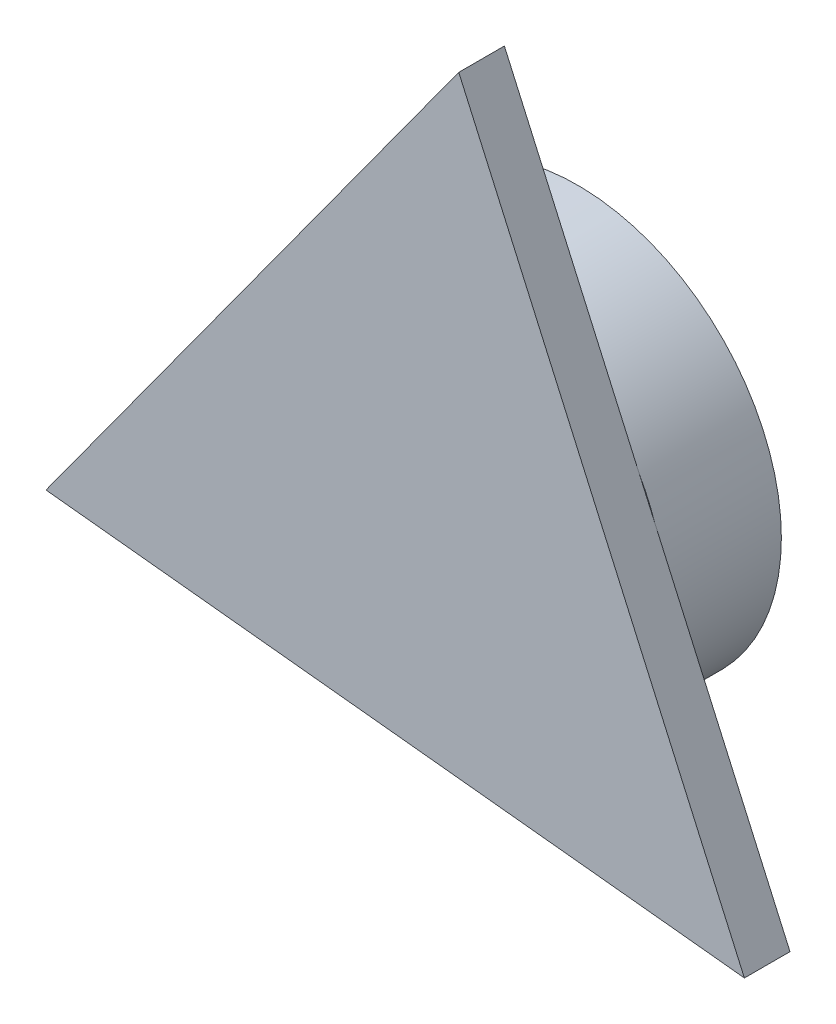
ISO-10303-21;
HEADER;
FILE_DESCRIPTION(('STEP AP214'),'2;1');
FILE_NAME('part.step','',(''),(''),'','','');
FILE_SCHEMA(('AUTOMOTIVE_DESIGN { 1 0 10303 214 1 1 1 1 }'));
ENDSEC;
DATA;
#1=APPLICATION_CONTEXT('core data for automotive mechanical design processes');
#2=APPLICATION_PROTOCOL_DEFINITION('international standard','automotive_design',2000,#1);
#3=PRODUCT_CONTEXT('',#1,'mechanical');
#4=PRODUCT('Part','Part','',(#3));
#5=PRODUCT_RELATED_PRODUCT_CATEGORY('part','',(#4));
#6=PRODUCT_DEFINITION_FORMATION('','',#4);
#7=PRODUCT_DEFINITION_CONTEXT('part definition',#1,'design');
#8=PRODUCT_DEFINITION('design','',#6,#7);
#9=PRODUCT_DEFINITION_SHAPE('','',#8);
#10=(LENGTH_UNIT() NAMED_UNIT(*) SI_UNIT(.MILLI.,.METRE.));
#11=(NAMED_UNIT(*) PLANE_ANGLE_UNIT() SI_UNIT($,.RADIAN.));
#12=(NAMED_UNIT(*) SI_UNIT($,.STERADIAN.) SOLID_ANGLE_UNIT());
#13=UNCERTAINTY_MEASURE_WITH_UNIT(LENGTH_MEASURE(1.E-05),#10,'distance_accuracy_value','');
#14=(GEOMETRIC_REPRESENTATION_CONTEXT(3) GLOBAL_UNCERTAINTY_ASSIGNED_CONTEXT((#13)) GLOBAL_UNIT_ASSIGNED_CONTEXT((#10,
#11,#12)) REPRESENTATION_CONTEXT('',''));
#15=CARTESIAN_POINT('',(0.,0.,0.));
#16=DIRECTION('',(0.,0.,1.));
#17=DIRECTION('',(1.,0.,0.));
#18=AXIS2_PLACEMENT_3D('',#15,#16,#17);
#19=CARTESIAN_POINT('',(0.,0.,19.32));
#20=DIRECTION('',(0.,0.,-1.));
#21=DIRECTION('',(-1.,0.,0.));
#22=AXIS2_PLACEMENT_3D('',#19,#20,#21);
#23=PLANE('',#22);
#24=CARTESIAN_POINT('',(51.9567828541551,1.17038599399259,19.32));
#25=DIRECTION('',(0.,0.,-1.));
#26=DIRECTION('',(-1.,0.,0.));
#27=AXIS2_PLACEMENT_3D('',#24,#25,#26);
#28=CIRCLE('',#27,4.465);
#29=CARTESIAN_POINT('',(55.851499327286,3.35382561851228,19.32));
#30=VERTEX_POINT('',#29);
#31=CARTESIAN_POINT('',(56.1854687081211,2.60371810779862,19.32));
#32=VERTEX_POINT('',#31);
#33=EDGE_CURVE('E172',#30,#32,#28,.T.);
#34=ORIENTED_EDGE('',*,*,#33,.F.);
#35=DIRECTION('',(0.406736643075804,-0.913545457642599,0.));
#36=VECTOR('',#35,1.);
#37=CARTESIAN_POINT('',(52.8862678126239,10.0138446435829,19.32));
#38=LINE('',#37,#36);
#39=EDGE_CURVE('E11',#30,#32,#38,.T.);
#40=ORIENTED_EDGE('',*,*,#39,.T.);
#41=EDGE_LOOP('',(#34,#40));
#42=FACE_BOUND('',#41,.T.);
#43=ADVANCED_FACE('F37',(#42),#23,.F.);
#44=CARTESIAN_POINT('',(51.9003388000545,-3.29425722453637,19.32));
#45=VERTEX_POINT('',#44);
#46=CARTESIAN_POINT('',(51.0837419497869,-3.20842943706863,19.32));
#47=VERTEX_POINT('',#46);
#48=EDGE_CURVE('E173',#45,#47,#28,.T.);
#49=ORIENTED_EDGE('',*,*,#48,.F.);
#50=DIRECTION('',(-0.994521895368274,0.10452846326765,0.));
#51=VECTOR('',#50,1.);
#52=CARTESIAN_POINT('',(59.1507002227832,-4.056300917272,19.32));
#53=LINE('',#52,#51);
#54=EDGE_CURVE('E46',#45,#47,#53,.T.);
#55=ORIENTED_EDGE('',*,*,#54,.T.);
#56=EDGE_LOOP('',(#49,#55));
#57=FACE_BOUND('',#56,.T.);
#58=ADVANCED_FACE('F145',(#57),#23,.F.);
#59=CARTESIAN_POINT('',(51.9567828541551,1.17038599399259,26.6697222151364));
#60=DIRECTION('',(0.,0.,-1.));
#61=DIRECTION('',(-1.,0.,0.));
#62=AXIS2_PLACEMENT_3D('',#59,#60,#61);
#63=CYLINDRICAL_SURFACE('',#62,1.925);
#64=CARTESIAN_POINT('',(51.9567828541551,1.17038599399259,19.32));
#65=DIRECTION('',(0.,0.,-1.));
#66=DIRECTION('',(-1.,0.,0.));
#67=AXIS2_PLACEMENT_3D('',#64,#65,#66);
#68=CIRCLE('',#67,1.925);
#69=CARTESIAN_POINT('',(50.0317828541551,1.17038599399259,19.32));
#70=VERTEX_POINT('',#69);
#71=EDGE_CURVE('E116',#70,#70,#68,.F.);
#72=ORIENTED_EDGE('',*,*,#71,.T.);
#73=EDGE_LOOP('',(#72));
#74=FACE_BOUND('',#73,.T.);
#75=CARTESIAN_POINT('',(51.9567828541551,1.17038599399259,16.78));
#76=DIRECTION('',(0.,0.,-1.));
#77=DIRECTION('',(1.,0.,0.));
#78=AXIS2_PLACEMENT_3D('',#75,#76,#77);
#79=CIRCLE('',#78,1.925);
#80=CARTESIAN_POINT('',(53.8817828541551,1.17038599399259,16.78));
#81=VERTEX_POINT('',#80);
#82=EDGE_CURVE('E120',#81,#81,#79,.T.);
#83=ORIENTED_EDGE('',*,*,#82,.T.);
#84=EDGE_LOOP('',(#83));
#85=FACE_BOUND('',#84,.T.);
#86=ADVANCED_FACE('F133',(#74,#85),#63,.F.);
#87=CARTESIAN_POINT('',(51.9567828541551,1.17038599399259,16.78));
#88=DIRECTION('',(0.,0.,1.));
#89=DIRECTION('',(1.,0.,0.));
#90=AXIS2_PLACEMENT_3D('',#87,#88,#89);
#91=PLANE('',#90);
#92=CARTESIAN_POINT('',(51.9567828541551,1.17038599399259,16.78));
#93=DIRECTION('',(0.,0.,1.));
#94=DIRECTION('',(1.,0.,0.));
#95=AXIS2_PLACEMENT_3D('',#92,#93,#94);
#96=CIRCLE('',#95,4.465);
#97=CARTESIAN_POINT('',(56.4217828541551,1.17038599399259,16.78));
#98=VERTEX_POINT('',#97);
#99=EDGE_CURVE('E126',#98,#98,#96,.F.);
#100=ORIENTED_EDGE('',*,*,#99,.T.);
#101=EDGE_LOOP('',(#100));
#102=FACE_BOUND('',#101,.T.);
#103=ORIENTED_EDGE('',*,*,#82,.F.);
#104=EDGE_LOOP('',(#103));
#105=FACE_BOUND('',#104,.T.);
#106=ADVANCED_FACE('F135',(#102,#105),#91,.F.);
#107=CARTESIAN_POINT('',(51.9567828541551,1.17038599399259,16.78));
#108=DIRECTION('',(0.,0.,1.));
#109=DIRECTION('',(1.,0.,0.));
#110=AXIS2_PLACEMENT_3D('',#107,#108,#109);
#111=CYLINDRICAL_SURFACE('',#110,4.465);
#112=ORIENTED_EDGE('',*,*,#99,.F.);
#113=EDGE_LOOP('',(#112));
#114=FACE_BOUND('',#113,.T.);
#115=CARTESIAN_POINT('',(48.1185104351256,3.45158958800109,19.32));
#116=VERTEX_POINT('',#115);
#117=CARTESIAN_POINT('',(48.6011379045566,4.11586931124871,19.32));
#118=VERTEX_POINT('',#117);
#119=EDGE_CURVE('E41',#116,#118,#28,.T.);
#120=ORIENTED_EDGE('',*,*,#119,.T.);
#121=EDGE_CURVE('E169',#118,#30,#28,.T.);
#122=ORIENTED_EDGE('',*,*,#121,.T.);
#123=ORIENTED_EDGE('',*,*,#33,.T.);
#124=EDGE_CURVE('E99',#32,#45,#28,.T.);
#125=ORIENTED_EDGE('',*,*,#124,.T.);
#126=ORIENTED_EDGE('',*,*,#48,.T.);
#127=EDGE_CURVE('E129',#47,#116,#28,.T.);
#128=ORIENTED_EDGE('',*,*,#127,.T.);
#129=EDGE_LOOP('',(#120,#122,#123,#125,#126,#128));
#130=FACE_BOUND('',#129,.T.);
#131=ADVANCED_FACE('F137',(#114,#130),#111,.T.);
#132=ORIENTED_EDGE('',*,*,#119,.F.);
#133=DIRECTION('',(0.587785252292469,0.80901699437495,0.));
#134=VECTOR('',#133,1.);
#135=CARTESIAN_POINT('',(43.8333805270583,-2.44638574433302,19.32));
#136=LINE('',#135,#134);
#137=EDGE_CURVE('E61',#116,#118,#136,.T.);
#138=ORIENTED_EDGE('',*,*,#137,.T.);
#139=EDGE_LOOP('',(#132,#138));
#140=FACE_BOUND('',#139,.T.);
#141=ADVANCED_FACE('F39',(#140),#23,.F.);
#142=CARTESIAN_POINT('',(0.,0.,20.32));
#143=DIRECTION('',(0.,0.,-1.));
#144=DIRECTION('',(-1.,0.,0.));
#145=AXIS2_PLACEMENT_3D('',#142,#143,#144);
#146=PLANE('',#145);
#147=DIRECTION('',(0.406736643075804,-0.913545457642599,0.));
#148=VECTOR('',#147,1.);
#149=CARTESIAN_POINT('',(52.8862678126239,10.0138446435829,20.32));
#150=LINE('',#149,#148);
#151=CARTESIAN_POINT('',(52.8862678126239,10.0138446435829,20.32));
#152=VERTEX_POINT('',#151);
#153=CARTESIAN_POINT('',(59.1507002227832,-4.056300917272,20.32));
#154=VERTEX_POINT('',#153);
#155=EDGE_CURVE('E115',#152,#154,#150,.T.);
#156=ORIENTED_EDGE('',*,*,#155,.F.);
#157=DIRECTION('',(0.587785252292469,0.80901699437495,0.));
#158=VECTOR('',#157,1.);
#159=CARTESIAN_POINT('',(43.8333805270583,-2.44638574433302,20.32));
#160=LINE('',#159,#158);
#161=CARTESIAN_POINT('',(43.8333805270583,-2.44638574433302,20.32));
#162=VERTEX_POINT('',#161);
#163=EDGE_CURVE('E102',#162,#152,#160,.T.);
#164=ORIENTED_EDGE('',*,*,#163,.F.);
#165=DIRECTION('',(-0.994521895368274,0.10452846326765,0.));
#166=VECTOR('',#165,1.);
#167=CARTESIAN_POINT('',(59.1507002227832,-4.056300917272,20.32));
#168=LINE('',#167,#166);
#169=EDGE_CURVE('E182',#154,#162,#168,.T.);
#170=ORIENTED_EDGE('',*,*,#169,.F.);
#171=EDGE_LOOP('',(#156,#164,#170));
#172=FACE_BOUND('',#171,.T.);
#173=ADVANCED_FACE('F156',(#172),#146,.F.);
#174=CARTESIAN_POINT('',(43.8333805270583,-2.44638574433302,19.32));
#175=DIRECTION('',(0.80901699437495,-0.587785252292469,0.));
#176=DIRECTION('',(0.587785252292469,0.80901699437495,0.));
#177=AXIS2_PLACEMENT_3D('',#174,#175,#176);
#178=PLANE('',#177);
#179=ORIENTED_EDGE('',*,*,#163,.T.);
#180=DIRECTION('',(0.,0.,1.));
#181=VECTOR('',#180,1.);
#182=CARTESIAN_POINT('',(52.8862678126239,10.0138446435829,19.32));
#183=LINE('',#182,#181);
#184=CARTESIAN_POINT('',(52.8862678126239,10.0138446435829,19.32));
#185=VERTEX_POINT('',#184);
#186=EDGE_CURVE('E122',#185,#152,#183,.T.);
#187=ORIENTED_EDGE('',*,*,#186,.F.);
#188=EDGE_CURVE('E56',#118,#185,#136,.T.);
#189=ORIENTED_EDGE('',*,*,#188,.F.);
#190=ORIENTED_EDGE('',*,*,#137,.F.);
#191=CARTESIAN_POINT('',(43.8333805270583,-2.44638574433302,19.32));
#192=VERTEX_POINT('',#191);
#193=EDGE_CURVE('E171',#192,#116,#136,.T.);
#194=ORIENTED_EDGE('',*,*,#193,.F.);
#195=DIRECTION('',(0.,0.,1.));
#196=VECTOR('',#195,1.);
#197=CARTESIAN_POINT('',(43.8333805270583,-2.44638574433302,19.32));
#198=LINE('',#197,#196);
#199=EDGE_CURVE('E117',#192,#162,#198,.T.);
#200=ORIENTED_EDGE('',*,*,#199,.T.);
#201=EDGE_LOOP('',(#179,#187,#189,#190,#194,#200));
#202=FACE_BOUND('',#201,.T.);
#203=ADVANCED_FACE('F161',(#202),#178,.F.);
#204=CARTESIAN_POINT('',(59.1507002227832,-4.056300917272,19.32));
#205=DIRECTION('',(0.10452846326765,0.994521895368274,0.));
#206=DIRECTION('',(-0.994521895368274,0.10452846326765,0.));
#207=AXIS2_PLACEMENT_3D('',#204,#205,#206);
#208=PLANE('',#207);
#209=ORIENTED_EDGE('',*,*,#169,.T.);
#210=ORIENTED_EDGE('',*,*,#199,.F.);
#211=EDGE_CURVE('E110',#47,#192,#53,.T.);
#212=ORIENTED_EDGE('',*,*,#211,.F.);
#213=ORIENTED_EDGE('',*,*,#54,.F.);
#214=CARTESIAN_POINT('',(59.1507002227832,-4.056300917272,19.32));
#215=VERTEX_POINT('',#214);
#216=EDGE_CURVE('E96',#215,#45,#53,.T.);
#217=ORIENTED_EDGE('',*,*,#216,.F.);
#218=DIRECTION('',(0.,0.,1.));
#219=VECTOR('',#218,1.);
#220=CARTESIAN_POINT('',(59.1507002227832,-4.056300917272,19.32));
#221=LINE('',#220,#219);
#222=EDGE_CURVE('E106',#215,#154,#221,.T.);
#223=ORIENTED_EDGE('',*,*,#222,.T.);
#224=EDGE_LOOP('',(#209,#210,#212,#213,#217,#223));
#225=FACE_BOUND('',#224,.T.);
#226=ADVANCED_FACE('F105',(#225),#208,.F.);
#227=CARTESIAN_POINT('',(52.8862678126239,10.0138446435829,19.32));
#228=DIRECTION('',(-0.913545457642599,-0.406736643075804,0.));
#229=DIRECTION('',(0.406736643075804,-0.913545457642599,0.));
#230=AXIS2_PLACEMENT_3D('',#227,#228,#229);
#231=PLANE('',#230);
#232=ORIENTED_EDGE('',*,*,#155,.T.);
#233=ORIENTED_EDGE('',*,*,#222,.F.);
#234=EDGE_CURVE('E49',#32,#215,#38,.T.);
#235=ORIENTED_EDGE('',*,*,#234,.F.);
#236=ORIENTED_EDGE('',*,*,#39,.F.);
#237=EDGE_CURVE('E48',#185,#30,#38,.T.);
#238=ORIENTED_EDGE('',*,*,#237,.F.);
#239=ORIENTED_EDGE('',*,*,#186,.T.);
#240=EDGE_LOOP('',(#232,#233,#235,#236,#238,#239));
#241=FACE_BOUND('',#240,.T.);
#242=ADVANCED_FACE('F112',(#241),#231,.F.);
#243=CARTESIAN_POINT('',(0.,0.,19.32));
#244=DIRECTION('',(0.,0.,-1.));
#245=DIRECTION('',(-1.,0.,0.));
#246=AXIS2_PLACEMENT_3D('',#243,#244,#245);
#247=PLANE('',#246);
#248=ORIENTED_EDGE('',*,*,#127,.F.);
#249=ORIENTED_EDGE('',*,*,#211,.T.);
#250=ORIENTED_EDGE('',*,*,#193,.T.);
#251=EDGE_LOOP('',(#248,#249,#250));
#252=FACE_BOUND('',#251,.T.);
#253=ADVANCED_FACE('F187',(#252),#247,.T.);
#254=ORIENTED_EDGE('',*,*,#124,.F.);
#255=ORIENTED_EDGE('',*,*,#234,.T.);
#256=ORIENTED_EDGE('',*,*,#216,.T.);
#257=EDGE_LOOP('',(#254,#255,#256));
#258=FACE_BOUND('',#257,.T.);
#259=ADVANCED_FACE('F95',(#258),#247,.T.);
#260=ORIENTED_EDGE('',*,*,#121,.F.);
#261=ORIENTED_EDGE('',*,*,#188,.T.);
#262=ORIENTED_EDGE('',*,*,#237,.T.);
#263=EDGE_LOOP('',(#260,#261,#262));
#264=FACE_BOUND('',#263,.T.);
#265=ADVANCED_FACE('F179',(#264),#247,.T.);
#266=ORIENTED_EDGE('',*,*,#71,.F.);
#267=EDGE_LOOP('',(#266));
#268=FACE_BOUND('',#267,.T.);
#269=ADVANCED_FACE('F190',(#268),#247,.T.);
#270=CLOSED_SHELL('',(#43,#58,#86,#106,#131,#141,#173,#203,#226,#242,#253,#259,#265,#269));
#271=MANIFOLD_SOLID_BREP('B2',#270);
#272=ADVANCED_BREP_SHAPE_REPRESENTATION('',(#18,#271),#14);
#273=SHAPE_DEFINITION_REPRESENTATION(#9,#272);
ENDSEC;
END-ISO-10303-21;
